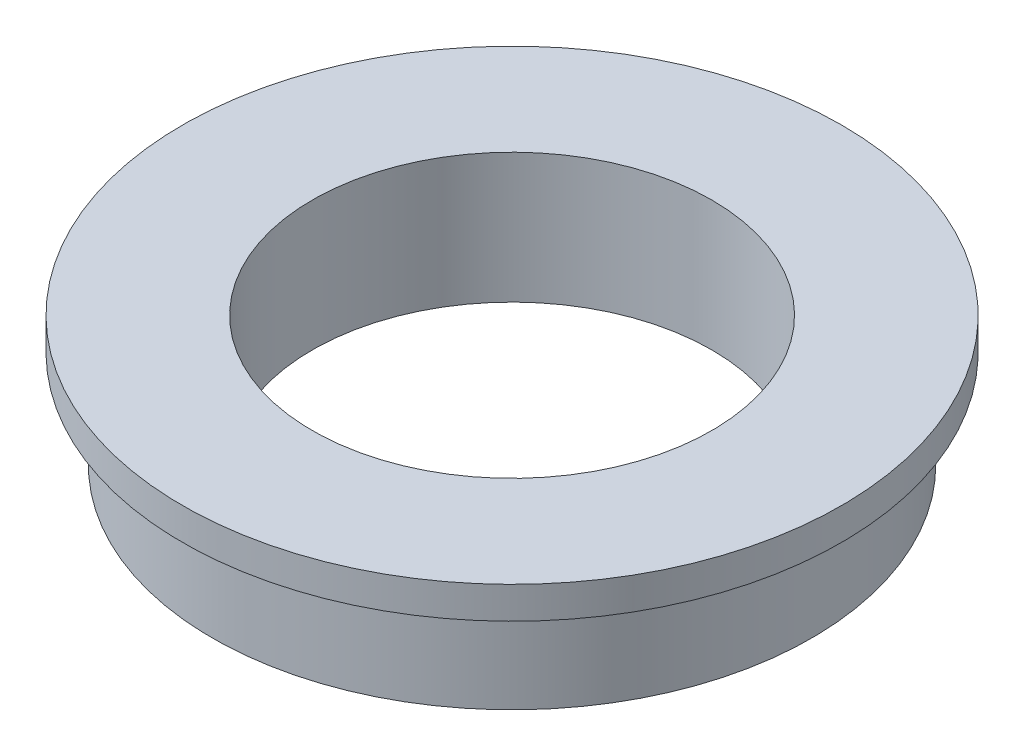
ISO-10303-21;
HEADER;
FILE_DESCRIPTION(('STEP AP214'),'2;1');
FILE_NAME('part.step','',(''),(''),'','','');
FILE_SCHEMA(('AUTOMOTIVE_DESIGN { 1 0 10303 214 1 1 1 1 }'));
ENDSEC;
DATA;
#1=APPLICATION_CONTEXT('core data for automotive mechanical design processes');
#2=APPLICATION_PROTOCOL_DEFINITION('international standard','automotive_design',2000,#1);
#3=PRODUCT_CONTEXT('',#1,'mechanical');
#4=PRODUCT('Part','Part','',(#3));
#5=PRODUCT_RELATED_PRODUCT_CATEGORY('part','',(#4));
#6=PRODUCT_DEFINITION_FORMATION('','',#4);
#7=PRODUCT_DEFINITION_CONTEXT('part definition',#1,'design');
#8=PRODUCT_DEFINITION('design','',#6,#7);
#9=PRODUCT_DEFINITION_SHAPE('','',#8);
#10=(LENGTH_UNIT() NAMED_UNIT(*) SI_UNIT(.MILLI.,.METRE.));
#11=(NAMED_UNIT(*) PLANE_ANGLE_UNIT() SI_UNIT($,.RADIAN.));
#12=(NAMED_UNIT(*) SI_UNIT($,.STERADIAN.) SOLID_ANGLE_UNIT());
#13=UNCERTAINTY_MEASURE_WITH_UNIT(LENGTH_MEASURE(1.E-05),#10,'distance_accuracy_value','');
#14=(GEOMETRIC_REPRESENTATION_CONTEXT(3) GLOBAL_UNCERTAINTY_ASSIGNED_CONTEXT((#13)) GLOBAL_UNIT_ASSIGNED_CONTEXT((#10,
#11,#12)) REPRESENTATION_CONTEXT('',''));
#15=CARTESIAN_POINT('',(0.,0.,0.));
#16=DIRECTION('',(0.,0.,1.));
#17=DIRECTION('',(1.,0.,0.));
#18=AXIS2_PLACEMENT_3D('',#15,#16,#17);
#19=CARTESIAN_POINT('',(8.25,0.8,0.));
#20=DIRECTION('',(0.,1.,0.));
#21=DIRECTION('',(0.,0.,1.));
#22=AXIS2_PLACEMENT_3D('',#19,#20,#21);
#23=PLANE('',#22);
#24=CARTESIAN_POINT('',(0.,0.8,0.));
#25=DIRECTION('',(0.,-1.,0.));
#26=DIRECTION('',(0.,0.,-1.));
#27=AXIS2_PLACEMENT_3D('',#24,#25,#26);
#28=CIRCLE('',#27,5.);
#29=CARTESIAN_POINT('',(0.,0.8,-5.));
#30=VERTEX_POINT('',#29);
#31=EDGE_CURVE('E10',#30,#30,#28,.T.);
#32=ORIENTED_EDGE('',*,*,#31,.T.);
#33=EDGE_LOOP('',(#32));
#34=FACE_BOUND('',#33,.T.);
#35=CARTESIAN_POINT('',(0.,0.8,0.));
#36=DIRECTION('',(0.,-1.,0.));
#37=DIRECTION('',(0.,0.,-1.));
#38=AXIS2_PLACEMENT_3D('',#35,#36,#37);
#39=CIRCLE('',#38,8.25);
#40=CARTESIAN_POINT('',(0.,0.8,-8.25));
#41=VERTEX_POINT('',#40);
#42=EDGE_CURVE('E54',#41,#41,#39,.T.);
#43=ORIENTED_EDGE('',*,*,#42,.F.);
#44=EDGE_LOOP('',(#43));
#45=FACE_BOUND('',#44,.T.);
#46=ADVANCED_FACE('F32',(#34,#45),#23,.T.);
#47=CARTESIAN_POINT('',(0.,0.,0.));
#48=DIRECTION('',(0.,-1.,0.));
#49=DIRECTION('',(0.,0.,-1.));
#50=AXIS2_PLACEMENT_3D('',#47,#48,#49);
#51=CYLINDRICAL_SURFACE('',#50,5.);
#52=CARTESIAN_POINT('',(0.,-2.45,0.));
#53=DIRECTION('',(0.,-1.,0.));
#54=DIRECTION('',(0.,0.,-1.));
#55=AXIS2_PLACEMENT_3D('',#52,#53,#54);
#56=CIRCLE('',#55,5.);
#57=CARTESIAN_POINT('',(0.,-2.45,-5.));
#58=VERTEX_POINT('',#57);
#59=EDGE_CURVE('E38',#58,#58,#56,.T.);
#60=ORIENTED_EDGE('',*,*,#59,.T.);
#61=EDGE_LOOP('',(#60));
#62=FACE_BOUND('',#61,.T.);
#63=ORIENTED_EDGE('',*,*,#31,.F.);
#64=EDGE_LOOP('',(#63));
#65=FACE_BOUND('',#64,.T.);
#66=ADVANCED_FACE('F62',(#62,#65),#51,.F.);
#67=CARTESIAN_POINT('',(5.,-2.45,0.));
#68=DIRECTION('',(0.,-1.,0.));
#69=DIRECTION('',(0.,0.,-1.));
#70=AXIS2_PLACEMENT_3D('',#67,#68,#69);
#71=PLANE('',#70);
#72=CARTESIAN_POINT('',(0.,-2.45,0.));
#73=DIRECTION('',(0.,-1.,0.));
#74=DIRECTION('',(0.,0.,-1.));
#75=AXIS2_PLACEMENT_3D('',#72,#73,#74);
#76=CIRCLE('',#75,7.5);
#77=CARTESIAN_POINT('',(0.,-2.45,-7.5));
#78=VERTEX_POINT('',#77);
#79=EDGE_CURVE('E42',#78,#78,#76,.T.);
#80=ORIENTED_EDGE('',*,*,#79,.T.);
#81=EDGE_LOOP('',(#80));
#82=FACE_BOUND('',#81,.T.);
#83=ORIENTED_EDGE('',*,*,#59,.F.);
#84=EDGE_LOOP('',(#83));
#85=FACE_BOUND('',#84,.T.);
#86=ADVANCED_FACE('F66',(#82,#85),#71,.T.);
#87=CARTESIAN_POINT('',(0.,0.,0.));
#88=DIRECTION('',(0.,-1.,0.));
#89=DIRECTION('',(0.,0.,-1.));
#90=AXIS2_PLACEMENT_3D('',#87,#88,#89);
#91=CYLINDRICAL_SURFACE('',#90,7.5);
#92=CARTESIAN_POINT('',(0.,0.,0.));
#93=DIRECTION('',(0.,-1.,0.));
#94=DIRECTION('',(0.,0.,-1.));
#95=AXIS2_PLACEMENT_3D('',#92,#93,#94);
#96=CIRCLE('',#95,7.5);
#97=CARTESIAN_POINT('',(0.,0.,-7.5));
#98=VERTEX_POINT('',#97);
#99=EDGE_CURVE('E46',#98,#98,#96,.T.);
#100=ORIENTED_EDGE('',*,*,#99,.T.);
#101=EDGE_LOOP('',(#100));
#102=FACE_BOUND('',#101,.T.);
#103=ORIENTED_EDGE('',*,*,#79,.F.);
#104=EDGE_LOOP('',(#103));
#105=FACE_BOUND('',#104,.T.);
#106=ADVANCED_FACE('F70',(#102,#105),#91,.T.);
#107=CARTESIAN_POINT('',(7.5,0.,0.));
#108=DIRECTION('',(0.,-1.,0.));
#109=DIRECTION('',(0.,0.,-1.));
#110=AXIS2_PLACEMENT_3D('',#107,#108,#109);
#111=PLANE('',#110);
#112=CARTESIAN_POINT('',(0.,0.,0.));
#113=DIRECTION('',(0.,-1.,0.));
#114=DIRECTION('',(0.,0.,-1.));
#115=AXIS2_PLACEMENT_3D('',#112,#113,#114);
#116=CIRCLE('',#115,8.25);
#117=CARTESIAN_POINT('',(0.,0.,-8.25));
#118=VERTEX_POINT('',#117);
#119=EDGE_CURVE('E51',#118,#118,#116,.T.);
#120=ORIENTED_EDGE('',*,*,#119,.T.);
#121=EDGE_LOOP('',(#120));
#122=FACE_BOUND('',#121,.T.);
#123=ORIENTED_EDGE('',*,*,#99,.F.);
#124=EDGE_LOOP('',(#123));
#125=FACE_BOUND('',#124,.T.);
#126=ADVANCED_FACE('F77',(#122,#125),#111,.T.);
#127=CARTESIAN_POINT('',(0.,0.,0.));
#128=DIRECTION('',(0.,-1.,0.));
#129=DIRECTION('',(0.,0.,-1.));
#130=AXIS2_PLACEMENT_3D('',#127,#128,#129);
#131=CYLINDRICAL_SURFACE('',#130,8.25);
#132=ORIENTED_EDGE('',*,*,#42,.T.);
#133=EDGE_LOOP('',(#132));
#134=FACE_BOUND('',#133,.T.);
#135=ORIENTED_EDGE('',*,*,#119,.F.);
#136=EDGE_LOOP('',(#135));
#137=FACE_BOUND('',#136,.T.);
#138=ADVANCED_FACE('F58',(#134,#137),#131,.T.);
#139=CLOSED_SHELL('',(#46,#66,#86,#106,#126,#138));
#140=MANIFOLD_SOLID_BREP('B2',#139);
#141=ADVANCED_BREP_SHAPE_REPRESENTATION('',(#18,#140),#14);
#142=SHAPE_DEFINITION_REPRESENTATION(#9,#141);
ENDSEC;
END-ISO-10303-21;
